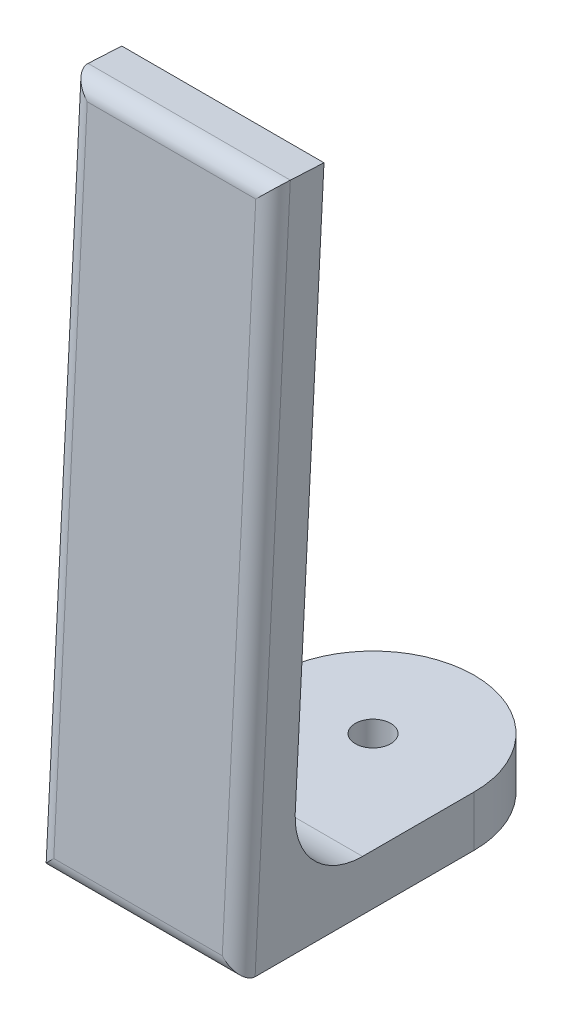
ISO-10303-21;
HEADER;
FILE_DESCRIPTION(('STEP AP214'),'2;1');
FILE_NAME('part.step','',(''),(''),'','','');
FILE_SCHEMA(('AUTOMOTIVE_DESIGN { 1 0 10303 214 1 1 1 1 }'));
ENDSEC;
DATA;
#1=APPLICATION_CONTEXT('core data for automotive mechanical design processes');
#2=APPLICATION_PROTOCOL_DEFINITION('international standard','automotive_design',2000,#1);
#3=PRODUCT_CONTEXT('',#1,'mechanical');
#4=PRODUCT('Part','Part','',(#3));
#5=PRODUCT_RELATED_PRODUCT_CATEGORY('part','',(#4));
#6=PRODUCT_DEFINITION_FORMATION('','',#4);
#7=PRODUCT_DEFINITION_CONTEXT('part definition',#1,'design');
#8=PRODUCT_DEFINITION('design','',#6,#7);
#9=PRODUCT_DEFINITION_SHAPE('','',#8);
#10=(LENGTH_UNIT() NAMED_UNIT(*) SI_UNIT(.MILLI.,.METRE.));
#11=(NAMED_UNIT(*) PLANE_ANGLE_UNIT() SI_UNIT($,.RADIAN.));
#12=(NAMED_UNIT(*) SI_UNIT($,.STERADIAN.) SOLID_ANGLE_UNIT());
#13=UNCERTAINTY_MEASURE_WITH_UNIT(LENGTH_MEASURE(1.E-05),#10,'distance_accuracy_value','');
#14=(GEOMETRIC_REPRESENTATION_CONTEXT(3) GLOBAL_UNCERTAINTY_ASSIGNED_CONTEXT((#13)) GLOBAL_UNIT_ASSIGNED_CONTEXT((#10,
#11,#12)) REPRESENTATION_CONTEXT('',''));
#15=CARTESIAN_POINT('',(0.,0.,0.));
#16=DIRECTION('',(0.,0.,1.));
#17=DIRECTION('',(1.,0.,0.));
#18=AXIS2_PLACEMENT_3D('',#15,#16,#17);
#19=CARTESIAN_POINT('',(12.,39.7881735214541,-5.08932685398161));
#20=DIRECTION('',(0.,-0.998629534754574,0.0523359562429466));
#21=DIRECTION('',(0.,-0.0523359562429466,-0.998629534754574));
#22=AXIS2_PLACEMENT_3D('',#19,#20,#21);
#23=PLANE('',#22);
#24=DIRECTION('',(0.,0.0523359562429466,0.998629534754574));
#25=VECTOR('',#24,1.);
#26=CARTESIAN_POINT('',(0.,39.7881735214541,-5.08932685398161));
#27=LINE('',#26,#25);
#28=CARTESIAN_POINT('',(0.,39.7881735214541,-5.08932685398161));
#29=VERTEX_POINT('',#28);
#30=CARTESIAN_POINT('',(0.,39.89284543394,-3.09206778447246));
#31=VERTEX_POINT('',#30);
#32=EDGE_CURVE('E167',#29,#31,#27,.T.);
#33=ORIENTED_EDGE('',*,*,#32,.T.);
#34=DIRECTION('',(-1.,0.,0.));
#35=VECTOR('',#34,1.);
#36=CARTESIAN_POINT('',(12.,39.89284543394,-3.09206778447246));
#37=LINE('',#36,#35);
#38=CARTESIAN_POINT('',(12.,39.89284543394,-3.09206778447246));
#39=VERTEX_POINT('',#38);
#40=EDGE_CURVE('E152',#31,#39,#37,.F.);
#41=ORIENTED_EDGE('',*,*,#40,.T.);
#42=DIRECTION('',(0.,0.0523359562429466,0.998629534754574));
#43=VECTOR('',#42,1.);
#44=CARTESIAN_POINT('',(12.,39.7881735214541,-5.08932685398161));
#45=LINE('',#44,#43);
#46=CARTESIAN_POINT('',(12.,39.7881735214541,-5.08932685398161));
#47=VERTEX_POINT('',#46);
#48=EDGE_CURVE('E132',#47,#39,#45,.T.);
#49=ORIENTED_EDGE('',*,*,#48,.F.);
#50=DIRECTION('',(-1.,0.,0.));
#51=VECTOR('',#50,1.);
#52=CARTESIAN_POINT('',(12.,39.7881735214541,-5.08932685398161));
#53=LINE('',#52,#51);
#54=EDGE_CURVE('E138',#47,#29,#53,.T.);
#55=ORIENTED_EDGE('',*,*,#54,.T.);
#56=EDGE_LOOP('',(#33,#41,#49,#55));
#57=FACE_BOUND('',#56,.T.);
#58=ADVANCED_FACE('F43',(#57),#23,.F.);
#59=CARTESIAN_POINT('',(12.,39.945181390183,-2.09343824971789));
#60=DIRECTION('',(0.,-0.0523359562429472,-0.998629534754574));
#61=DIRECTION('',(0.,0.998629534754574,-0.0523359562429472));
#62=AXIS2_PLACEMENT_3D('',#59,#60,#61);
#63=PLANE('',#62);
#64=DIRECTION('',(0.,-0.998629534754574,0.0523359562429472));
#65=VECTOR('',#64,1.);
#66=CARTESIAN_POINT('',(11.,39.945181390183,-2.09343824971789));
#67=LINE('',#66,#65);
#68=CARTESIAN_POINT('',(11.,1.05233595624295,-0.055150590526392));
#69=VERTEX_POINT('',#68);
#70=CARTESIAN_POINT('',(11.,38.9465518554284,-2.04110229347494));
#71=VERTEX_POINT('',#70);
#72=EDGE_CURVE('E181',#69,#71,#67,.F.);
#73=ORIENTED_EDGE('',*,*,#72,.T.);
#74=DIRECTION('',(-1.,0.,0.));
#75=VECTOR('',#74,1.);
#76=CARTESIAN_POINT('',(12.,38.9465518554284,-2.04110229347494));
#77=LINE('',#76,#75);
#78=CARTESIAN_POINT('',(1.,38.9465518554284,-2.04110229347494));
#79=VERTEX_POINT('',#78);
#80=EDGE_CURVE('E184',#71,#79,#77,.T.);
#81=ORIENTED_EDGE('',*,*,#80,.T.);
#82=DIRECTION('',(0.,-0.998629534754574,0.0523359562429472));
#83=VECTOR('',#82,1.);
#84=CARTESIAN_POINT('',(1.,39.945181390183,-2.09343824971789));
#85=LINE('',#84,#83);
#86=CARTESIAN_POINT('',(1.,1.05233595624295,-0.055150590526392));
#87=VERTEX_POINT('',#86);
#88=EDGE_CURVE('E148',#79,#87,#85,.T.);
#89=ORIENTED_EDGE('',*,*,#88,.T.);
#90=DIRECTION('',(-1.,0.,0.));
#91=VECTOR('',#90,1.);
#92=CARTESIAN_POINT('',(12.,1.05233595624295,-0.055150590526392));
#93=LINE('',#92,#91);
#94=EDGE_CURVE('E178',#87,#69,#93,.F.);
#95=ORIENTED_EDGE('',*,*,#94,.T.);
#96=EDGE_LOOP('',(#73,#81,#89,#95));
#97=FACE_BOUND('',#96,.T.);
#98=ADVANCED_FACE('F263',(#97),#63,.F.);
#99=CARTESIAN_POINT('',(12.,0.,0.));
#100=DIRECTION('',(0.,1.,0.));
#101=DIRECTION('',(0.,0.,1.));
#102=AXIS2_PLACEMENT_3D('',#99,#100,#101);
#103=PLANE('',#102);
#104=CARTESIAN_POINT('',(6.,0.,-14.));
#105=DIRECTION('',(0.,1.,0.));
#106=DIRECTION('',(0.,0.,1.));
#107=AXIS2_PLACEMENT_3D('',#104,#105,#106);
#108=CIRCLE('',#107,1.05);
#109=CARTESIAN_POINT('',(6.,0.,-12.95));
#110=VERTEX_POINT('',#109);
#111=EDGE_CURVE('E162',#110,#110,#108,.T.);
#112=ORIENTED_EDGE('',*,*,#111,.T.);
#113=EDGE_LOOP('',(#112));
#114=FACE_BOUND('',#113,.T.);
#115=DIRECTION('',(0.,0.,-1.));
#116=VECTOR('',#115,1.);
#117=CARTESIAN_POINT('',(0.,0.,0.));
#118=LINE('',#117,#116);
#119=CARTESIAN_POINT('',(0.,0.,-1.05378012528097));
#120=VERTEX_POINT('',#119);
#121=CARTESIAN_POINT('',(0.,0.,-14.));
#122=VERTEX_POINT('',#121);
#123=EDGE_CURVE('E170',#120,#122,#118,.T.);
#124=ORIENTED_EDGE('',*,*,#123,.T.);
#125=CARTESIAN_POINT('',(6.,0.,-14.));
#126=DIRECTION('',(0.,1.,0.));
#127=DIRECTION('',(0.,0.,1.));
#128=AXIS2_PLACEMENT_3D('',#125,#126,#127);
#129=CIRCLE('',#128,6.);
#130=CARTESIAN_POINT('',(6.,0.,-20.));
#131=VERTEX_POINT('',#130);
#132=EDGE_CURVE('E234',#122,#131,#129,.F.);
#133=ORIENTED_EDGE('',*,*,#132,.T.);
#134=CARTESIAN_POINT('',(6.,0.,-14.));
#135=DIRECTION('',(0.,1.,0.));
#136=DIRECTION('',(0.,0.,1.));
#137=AXIS2_PLACEMENT_3D('',#134,#135,#136);
#138=CIRCLE('',#137,6.);
#139=CARTESIAN_POINT('',(12.,0.,-14.));
#140=VERTEX_POINT('',#139);
#141=EDGE_CURVE('E231',#131,#140,#138,.F.);
#142=ORIENTED_EDGE('',*,*,#141,.T.);
#143=DIRECTION('',(0.,0.,-1.));
#144=VECTOR('',#143,1.);
#145=CARTESIAN_POINT('',(12.,0.,0.));
#146=LINE('',#145,#144);
#147=CARTESIAN_POINT('',(12.,0.,-1.05378012528097));
#148=VERTEX_POINT('',#147);
#149=EDGE_CURVE('E154',#148,#140,#146,.T.);
#150=ORIENTED_EDGE('',*,*,#149,.F.);
#151=DIRECTION('',(-1.,0.,0.));
#152=VECTOR('',#151,1.);
#153=CARTESIAN_POINT('',(12.,0.,-1.05378012528097));
#154=LINE('',#153,#152);
#155=EDGE_CURVE('E196',#148,#120,#154,.T.);
#156=ORIENTED_EDGE('',*,*,#155,.T.);
#157=EDGE_LOOP('',(#124,#133,#142,#150,#156));
#158=FACE_BOUND('',#157,.T.);
#159=ADVANCED_FACE('F276',(#114,#158),#103,.F.);
#160=CARTESIAN_POINT('',(12.,3.,-20.));
#161=DIRECTION('',(0.,-1.,0.));
#162=DIRECTION('',(0.,0.,-1.));
#163=AXIS2_PLACEMENT_3D('',#160,#161,#162);
#164=PLANE('',#163);
#165=CARTESIAN_POINT('',(6.,3.,-14.));
#166=DIRECTION('',(0.,1.,0.));
#167=DIRECTION('',(0.,0.,1.));
#168=AXIS2_PLACEMENT_3D('',#165,#166,#167);
#169=CIRCLE('',#168,1.05);
#170=CARTESIAN_POINT('',(6.,3.,-12.95));
#171=VERTEX_POINT('',#170);
#172=EDGE_CURVE('E221',#171,#171,#169,.T.);
#173=ORIENTED_EDGE('',*,*,#172,.F.);
#174=EDGE_LOOP('',(#173));
#175=FACE_BOUND('',#174,.T.);
#176=DIRECTION('',(0.,0.,1.));
#177=VECTOR('',#176,1.);
#178=CARTESIAN_POINT('',(0.,3.,-20.));
#179=LINE('',#178,#177);
#180=CARTESIAN_POINT('',(0.,3.,-14.));
#181=VERTEX_POINT('',#180);
#182=CARTESIAN_POINT('',(0.,3.,-7.37646087696676));
#183=VERTEX_POINT('',#182);
#184=EDGE_CURVE('E159',#181,#183,#179,.T.);
#185=ORIENTED_EDGE('',*,*,#184,.T.);
#186=DIRECTION('',(-1.,0.,0.));
#187=VECTOR('',#186,1.);
#188=CARTESIAN_POINT('',(12.,3.,-7.37646087696676));
#189=LINE('',#188,#187);
#190=CARTESIAN_POINT('',(12.,3.,-7.37646087696676));
#191=VERTEX_POINT('',#190);
#192=EDGE_CURVE('E59',#183,#191,#189,.F.);
#193=ORIENTED_EDGE('',*,*,#192,.T.);
#194=DIRECTION('',(0.,0.,1.));
#195=VECTOR('',#194,1.);
#196=CARTESIAN_POINT('',(12.,3.,-20.));
#197=LINE('',#196,#195);
#198=CARTESIAN_POINT('',(12.,3.,-14.));
#199=VERTEX_POINT('',#198);
#200=EDGE_CURVE('E139',#199,#191,#197,.T.);
#201=ORIENTED_EDGE('',*,*,#200,.F.);
#202=CARTESIAN_POINT('',(6.,3.,-14.));
#203=DIRECTION('',(0.,-1.,0.));
#204=DIRECTION('',(0.,0.,-1.));
#205=AXIS2_PLACEMENT_3D('',#202,#203,#204);
#206=CIRCLE('',#205,6.);
#207=CARTESIAN_POINT('',(6.,3.,-20.));
#208=VERTEX_POINT('',#207);
#209=EDGE_CURVE('E205',#199,#208,#206,.F.);
#210=ORIENTED_EDGE('',*,*,#209,.T.);
#211=CARTESIAN_POINT('',(6.,3.,-14.));
#212=DIRECTION('',(0.,-1.,0.));
#213=DIRECTION('',(0.,0.,-1.));
#214=AXIS2_PLACEMENT_3D('',#211,#212,#213);
#215=CIRCLE('',#214,6.);
#216=EDGE_CURVE('E224',#208,#181,#215,.F.);
#217=ORIENTED_EDGE('',*,*,#216,.T.);
#218=EDGE_LOOP('',(#185,#193,#201,#210,#217));
#219=FACE_BOUND('',#218,.T.);
#220=ADVANCED_FACE('F287',(#175,#219),#164,.F.);
#221=CARTESIAN_POINT('',(12.,3.,-3.16134037584289));
#222=DIRECTION('',(0.,0.0523359562429472,0.998629534754574));
#223=DIRECTION('',(0.,-0.998629534754574,0.0523359562429472));
#224=AXIS2_PLACEMENT_3D('',#221,#222,#223);
#225=PLANE('',#224);
#226=DIRECTION('',(0.,0.998629534754574,-0.0523359562429472));
#227=VECTOR('',#226,1.);
#228=CARTESIAN_POINT('',(12.,3.,-3.16134037584289));
#229=LINE('',#228,#227);
#230=CARTESIAN_POINT('',(12.,7.20934382497179,-3.38194273794846));
#231=VERTEX_POINT('',#230);
#232=EDGE_CURVE('E127',#231,#47,#229,.T.);
#233=ORIENTED_EDGE('',*,*,#232,.F.);
#234=DIRECTION('',(-1.,0.,0.));
#235=VECTOR('',#234,1.);
#236=CARTESIAN_POINT('',(0.,7.20934382497179,-3.38194273794846));
#237=LINE('',#236,#235);
#238=CARTESIAN_POINT('',(0.,7.20934382497179,-3.38194273794846));
#239=VERTEX_POINT('',#238);
#240=EDGE_CURVE('E240',#231,#239,#237,.T.);
#241=ORIENTED_EDGE('',*,*,#240,.T.);
#242=DIRECTION('',(0.,0.998629534754574,-0.0523359562429472));
#243=VECTOR('',#242,1.);
#244=CARTESIAN_POINT('',(0.,3.,-3.16134037584289));
#245=LINE('',#244,#243);
#246=EDGE_CURVE('E143',#239,#29,#245,.T.);
#247=ORIENTED_EDGE('',*,*,#246,.T.);
#248=ORIENTED_EDGE('',*,*,#54,.F.);
#249=EDGE_LOOP('',(#233,#241,#247,#248));
#250=FACE_BOUND('',#249,.T.);
#251=ADVANCED_FACE('F142',(#250),#225,.F.);
#252=CARTESIAN_POINT('',(12.,0.,0.));
#253=DIRECTION('',(1.,0.,0.));
#254=DIRECTION('',(0.,0.,-1.));
#255=AXIS2_PLACEMENT_3D('',#252,#253,#254);
#256=PLANE('',#255);
#257=ORIENTED_EDGE('',*,*,#149,.T.);
#258=DIRECTION('',(0.,1.,0.));
#259=VECTOR('',#258,1.);
#260=CARTESIAN_POINT('',(12.,3.00000000000001,-14.));
#261=LINE('',#260,#259);
#262=EDGE_CURVE('E237',#140,#199,#261,.T.);
#263=ORIENTED_EDGE('',*,*,#262,.T.);
#264=ORIENTED_EDGE('',*,*,#200,.T.);
#265=CARTESIAN_POINT('',(12.,7.,-7.37646087696676));
#266=DIRECTION('',(1.,0.,0.));
#267=DIRECTION('',(0.,0.,-1.));
#268=AXIS2_PLACEMENT_3D('',#265,#266,#267);
#269=CIRCLE('',#268,4.);
#270=EDGE_CURVE('E11',#191,#231,#269,.F.);
#271=ORIENTED_EDGE('',*,*,#270,.T.);
#272=ORIENTED_EDGE('',*,*,#232,.T.);
#273=ORIENTED_EDGE('',*,*,#48,.T.);
#274=DIRECTION('',(0.,-0.998629534754574,0.0523359562429472));
#275=VECTOR('',#274,1.);
#276=CARTESIAN_POINT('',(12.,-0.0523359562429472,-0.998629534754573));
#277=LINE('',#276,#275);
#278=CARTESIAN_POINT('',(12.,0.00137046524542638,-1.00144416903802));
#279=VERTEX_POINT('',#278);
#280=EDGE_CURVE('E193',#39,#279,#277,.T.);
#281=ORIENTED_EDGE('',*,*,#280,.T.);
#282=CARTESIAN_POINT('',(12.,1.,-1.05378012528097));
#283=DIRECTION('',(1.,0.,0.));
#284=DIRECTION('',(0.,0.,-1.));
#285=AXIS2_PLACEMENT_3D('',#282,#283,#284);
#286=CIRCLE('',#285,1.);
#287=EDGE_CURVE('E190',#279,#148,#286,.T.);
#288=ORIENTED_EDGE('',*,*,#287,.T.);
#289=EDGE_LOOP('',(#257,#263,#264,#271,#272,#273,#281,#288));
#290=FACE_BOUND('',#289,.T.);
#291=ADVANCED_FACE('F130',(#290),#256,.T.);
#292=CARTESIAN_POINT('',(0.,0.,0.));
#293=DIRECTION('',(1.,0.,0.));
#294=DIRECTION('',(0.,0.,-1.));
#295=AXIS2_PLACEMENT_3D('',#292,#293,#294);
#296=PLANE('',#295);
#297=ORIENTED_EDGE('',*,*,#184,.F.);
#298=DIRECTION('',(0.,1.,0.));
#299=VECTOR('',#298,1.);
#300=CARTESIAN_POINT('',(0.,0.,-14.));
#301=LINE('',#300,#299);
#302=EDGE_CURVE('E227',#181,#122,#301,.F.);
#303=ORIENTED_EDGE('',*,*,#302,.T.);
#304=ORIENTED_EDGE('',*,*,#123,.F.);
#305=CARTESIAN_POINT('',(0.,1.,-1.05378012528097));
#306=DIRECTION('',(1.,0.,0.));
#307=DIRECTION('',(0.,0.,-1.));
#308=AXIS2_PLACEMENT_3D('',#305,#306,#307);
#309=CIRCLE('',#308,1.);
#310=CARTESIAN_POINT('',(0.,0.00137046524542636,-1.00144416903802));
#311=VERTEX_POINT('',#310);
#312=EDGE_CURVE('E202',#120,#311,#309,.F.);
#313=ORIENTED_EDGE('',*,*,#312,.T.);
#314=DIRECTION('',(0.,-0.998629534754574,0.0523359562429472));
#315=VECTOR('',#314,1.);
#316=CARTESIAN_POINT('',(0.,-0.0523359562429472,-0.998629534754574));
#317=LINE('',#316,#315);
#318=EDGE_CURVE('E199',#311,#31,#317,.F.);
#319=ORIENTED_EDGE('',*,*,#318,.T.);
#320=ORIENTED_EDGE('',*,*,#32,.F.);
#321=ORIENTED_EDGE('',*,*,#246,.F.);
#322=CARTESIAN_POINT('',(0.,7.,-7.37646087696676));
#323=DIRECTION('',(1.,0.,0.));
#324=DIRECTION('',(0.,0.,-1.));
#325=AXIS2_PLACEMENT_3D('',#322,#323,#324);
#326=CIRCLE('',#325,4.);
#327=EDGE_CURVE('E52',#239,#183,#326,.T.);
#328=ORIENTED_EDGE('',*,*,#327,.T.);
#329=EDGE_LOOP('',(#297,#303,#304,#313,#319,#320,#321,#328));
#330=FACE_BOUND('',#329,.T.);
#331=ADVANCED_FACE('F249',(#330),#296,.F.);
#332=CARTESIAN_POINT('',(6.,-9.,-14.));
#333=DIRECTION('',(0.,1.,0.));
#334=DIRECTION('',(0.,0.,1.));
#335=AXIS2_PLACEMENT_3D('',#332,#333,#334);
#336=CYLINDRICAL_SURFACE('',#335,1.05);
#337=ORIENTED_EDGE('',*,*,#172,.T.);
#338=EDGE_LOOP('',(#337));
#339=FACE_BOUND('',#338,.T.);
#340=ORIENTED_EDGE('',*,*,#111,.F.);
#341=EDGE_LOOP('',(#340));
#342=FACE_BOUND('',#341,.T.);
#343=ADVANCED_FACE('F308',(#339,#342),#336,.F.);
#344=CARTESIAN_POINT('',(12.,1.,-1.05378012528097));
#345=DIRECTION('',(-1.,0.,0.));
#346=DIRECTION('',(0.,0.,1.));
#347=AXIS2_PLACEMENT_3D('',#344,#345,#346);
#348=CYLINDRICAL_SURFACE('',#347,1.);
#349=ORIENTED_EDGE('',*,*,#155,.F.);
#350=ORIENTED_EDGE('',*,*,#287,.F.);
#351=CARTESIAN_POINT('',(11.,1.,-1.05378012528097));
#352=DIRECTION('',(-0.707106781186547,-0.706137715918126,0.0370071095592704));
#353=DIRECTION('',(-0.707106781186547,0.706137715918126,-0.0370071095592704));
#354=AXIS2_PLACEMENT_3D('',#351,#352,#353);
#355=ELLIPSE('',#354,1.41421356237309,1.);
#356=EDGE_CURVE('E217',#69,#279,#355,.F.);
#357=ORIENTED_EDGE('',*,*,#356,.F.);
#358=ORIENTED_EDGE('',*,*,#94,.F.);
#359=CARTESIAN_POINT('',(1.,0.999999999999994,-1.05378012528097));
#360=DIRECTION('',(0.707106781186547,-0.706137715918126,0.0370071095592704));
#361=DIRECTION('',(-0.707106781186547,-0.706137715918126,0.0370071095592704));
#362=AXIS2_PLACEMENT_3D('',#359,#360,#361);
#363=ELLIPSE('',#362,1.41421356237309,1.);
#364=EDGE_CURVE('E213',#311,#87,#363,.F.);
#365=ORIENTED_EDGE('',*,*,#364,.F.);
#366=ORIENTED_EDGE('',*,*,#312,.F.);
#367=EDGE_LOOP('',(#349,#350,#357,#358,#365,#366));
#368=FACE_BOUND('',#367,.T.);
#369=ADVANCED_FACE('F272',(#368),#348,.T.);
#370=CARTESIAN_POINT('',(11.,-0.0523359562429472,-0.998629534754573));
#371=DIRECTION('',(0.,0.998629534754574,-0.0523359562429472));
#372=DIRECTION('',(0.,0.0523359562429472,0.998629534754574));
#373=AXIS2_PLACEMENT_3D('',#370,#371,#372);
#374=CYLINDRICAL_SURFACE('',#373,1.);
#375=ORIENTED_EDGE('',*,*,#356,.T.);
#376=ORIENTED_EDGE('',*,*,#280,.F.);
#377=CARTESIAN_POINT('',(11.,38.8942158991854,-3.03973182822951));
#378=DIRECTION('',(-0.707106781186547,0.706137715918126,-0.0370071095592704));
#379=DIRECTION('',(0.707106781186547,0.706137715918126,-0.0370071095592704));
#380=AXIS2_PLACEMENT_3D('',#377,#378,#379);
#381=ELLIPSE('',#380,1.41421356237309,1.);
#382=EDGE_CURVE('E209',#71,#39,#381,.T.);
#383=ORIENTED_EDGE('',*,*,#382,.F.);
#384=ORIENTED_EDGE('',*,*,#72,.F.);
#385=EDGE_LOOP('',(#375,#376,#383,#384));
#386=FACE_BOUND('',#385,.T.);
#387=ADVANCED_FACE('F267',(#386),#374,.T.);
#388=CARTESIAN_POINT('',(1.,39.89284543394,-3.09206778447246));
#389=DIRECTION('',(0.,-0.998629534754574,0.0523359562429472));
#390=DIRECTION('',(0.,-0.0523359562429472,-0.998629534754574));
#391=AXIS2_PLACEMENT_3D('',#388,#389,#390);
#392=CYLINDRICAL_SURFACE('',#391,1.);
#393=ORIENTED_EDGE('',*,*,#364,.T.);
#394=ORIENTED_EDGE('',*,*,#88,.F.);
#395=CARTESIAN_POINT('',(1.,38.8942158991854,-3.03973182822951));
#396=DIRECTION('',(-0.707106781186547,-0.706137715918126,0.0370071095592704));
#397=DIRECTION('',(0.707106781186547,-0.706137715918126,0.0370071095592704));
#398=AXIS2_PLACEMENT_3D('',#395,#396,#397);
#399=ELLIPSE('',#398,1.41421356237309,1.);
#400=EDGE_CURVE('E206',#31,#79,#399,.F.);
#401=ORIENTED_EDGE('',*,*,#400,.F.);
#402=ORIENTED_EDGE('',*,*,#318,.F.);
#403=EDGE_LOOP('',(#393,#394,#401,#402));
#404=FACE_BOUND('',#403,.T.);
#405=ADVANCED_FACE('F259',(#404),#392,.T.);
#406=CARTESIAN_POINT('',(12.,38.8942158991854,-3.03973182822951));
#407=DIRECTION('',(-1.,0.,0.));
#408=DIRECTION('',(0.,0.,1.));
#409=AXIS2_PLACEMENT_3D('',#406,#407,#408);
#410=CYLINDRICAL_SURFACE('',#409,1.);
#411=ORIENTED_EDGE('',*,*,#382,.T.);
#412=ORIENTED_EDGE('',*,*,#40,.F.);
#413=ORIENTED_EDGE('',*,*,#400,.T.);
#414=ORIENTED_EDGE('',*,*,#80,.F.);
#415=EDGE_LOOP('',(#411,#412,#413,#414));
#416=FACE_BOUND('',#415,.T.);
#417=ADVANCED_FACE('F253',(#416),#410,.T.);
#418=CARTESIAN_POINT('',(6.,0.,-14.));
#419=DIRECTION('',(0.,-1.,0.));
#420=DIRECTION('',(0.,0.,-1.));
#421=AXIS2_PLACEMENT_3D('',#418,#419,#420);
#422=CYLINDRICAL_SURFACE('',#421,6.);
#423=ORIENTED_EDGE('',*,*,#262,.F.);
#424=ORIENTED_EDGE('',*,*,#141,.F.);
#425=DIRECTION('',(0.,1.,0.));
#426=VECTOR('',#425,1.);
#427=CARTESIAN_POINT('',(6.,0.,-20.));
#428=LINE('',#427,#426);
#429=EDGE_CURVE('E210',#208,#131,#428,.F.);
#430=ORIENTED_EDGE('',*,*,#429,.F.);
#431=ORIENTED_EDGE('',*,*,#209,.F.);
#432=EDGE_LOOP('',(#423,#424,#430,#431));
#433=FACE_BOUND('',#432,.T.);
#434=ADVANCED_FACE('F285',(#433),#422,.T.);
#435=CARTESIAN_POINT('',(6.,0.,-14.));
#436=DIRECTION('',(0.,1.,0.));
#437=DIRECTION('',(0.,0.,1.));
#438=AXIS2_PLACEMENT_3D('',#435,#436,#437);
#439=CYLINDRICAL_SURFACE('',#438,6.);
#440=ORIENTED_EDGE('',*,*,#132,.F.);
#441=ORIENTED_EDGE('',*,*,#302,.F.);
#442=ORIENTED_EDGE('',*,*,#216,.F.);
#443=ORIENTED_EDGE('',*,*,#429,.T.);
#444=EDGE_LOOP('',(#440,#441,#442,#443));
#445=FACE_BOUND('',#444,.T.);
#446=ADVANCED_FACE('F280',(#445),#439,.T.);
#447=CARTESIAN_POINT('',(12.,7.,-7.37646087696676));
#448=DIRECTION('',(1.,0.,0.));
#449=DIRECTION('',(0.,0.,-1.));
#450=AXIS2_PLACEMENT_3D('',#447,#448,#449);
#451=CYLINDRICAL_SURFACE('',#450,4.);
#452=ORIENTED_EDGE('',*,*,#270,.F.);
#453=ORIENTED_EDGE('',*,*,#192,.F.);
#454=ORIENTED_EDGE('',*,*,#327,.F.);
#455=ORIENTED_EDGE('',*,*,#240,.F.);
#456=EDGE_LOOP('',(#452,#453,#454,#455));
#457=FACE_BOUND('',#456,.T.);
#458=ADVANCED_FACE('F45',(#457),#451,.F.);
#459=CLOSED_SHELL('',(#58,#98,#159,#220,#251,#291,#331,#343,#369,#387,#405,#417,#434,#446,#458));
#460=MANIFOLD_SOLID_BREP('B2',#459);
#461=ADVANCED_BREP_SHAPE_REPRESENTATION('',(#18,#460),#14);
#462=SHAPE_DEFINITION_REPRESENTATION(#9,#461);
ENDSEC;
END-ISO-10303-21;
